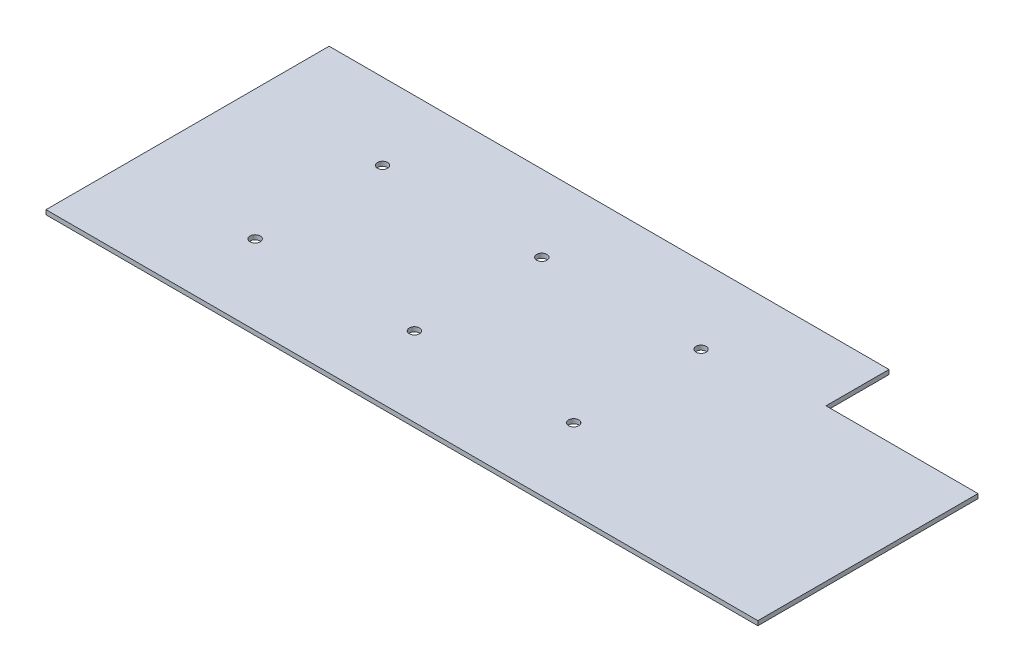
ISO-10303-21;
HEADER;
FILE_DESCRIPTION(('STEP AP214'),'2;1');
FILE_NAME('part.step','',(''),(''),'','','');
FILE_SCHEMA(('AUTOMOTIVE_DESIGN { 1 0 10303 214 1 1 1 1 }'));
ENDSEC;
DATA;
#1=APPLICATION_CONTEXT('core data for automotive mechanical design processes');
#2=APPLICATION_PROTOCOL_DEFINITION('international standard','automotive_design',2000,#1);
#3=PRODUCT_CONTEXT('',#1,'mechanical');
#4=PRODUCT('Part','Part','',(#3));
#5=PRODUCT_RELATED_PRODUCT_CATEGORY('part','',(#4));
#6=PRODUCT_DEFINITION_FORMATION('','',#4);
#7=PRODUCT_DEFINITION_CONTEXT('part definition',#1,'design');
#8=PRODUCT_DEFINITION('design','',#6,#7);
#9=PRODUCT_DEFINITION_SHAPE('','',#8);
#10=(LENGTH_UNIT() NAMED_UNIT(*) SI_UNIT(.MILLI.,.METRE.));
#11=(NAMED_UNIT(*) PLANE_ANGLE_UNIT() SI_UNIT($,.RADIAN.));
#12=(NAMED_UNIT(*) SI_UNIT($,.STERADIAN.) SOLID_ANGLE_UNIT());
#13=UNCERTAINTY_MEASURE_WITH_UNIT(LENGTH_MEASURE(1.E-05),#10,'distance_accuracy_value','');
#14=(GEOMETRIC_REPRESENTATION_CONTEXT(3) GLOBAL_UNCERTAINTY_ASSIGNED_CONTEXT((#13)) GLOBAL_UNIT_ASSIGNED_CONTEXT((#10,
#11,#12)) REPRESENTATION_CONTEXT('',''));
#15=CARTESIAN_POINT('',(0.,0.,0.));
#16=DIRECTION('',(0.,0.,1.));
#17=DIRECTION('',(1.,0.,0.));
#18=AXIS2_PLACEMENT_3D('',#15,#16,#17);
#19=CARTESIAN_POINT('',(558.8,3.5,0.));
#20=DIRECTION('',(0.,0.,-1.));
#21=DIRECTION('',(-1.,0.,0.));
#22=AXIS2_PLACEMENT_3D('',#19,#20,#21);
#23=PLANE('',#22);
#24=DIRECTION('',(1.,0.,0.));
#25=VECTOR('',#24,1.);
#26=CARTESIAN_POINT('',(558.8,0.,0.));
#27=LINE('',#26,#25);
#28=CARTESIAN_POINT('',(0.,0.,0.));
#29=VERTEX_POINT('',#28);
#30=CARTESIAN_POINT('',(558.8,0.,0.));
#31=VERTEX_POINT('',#30);
#32=EDGE_CURVE('E128',#29,#31,#27,.T.);
#33=ORIENTED_EDGE('',*,*,#32,.T.);
#34=DIRECTION('',(0.,-1.,0.));
#35=VECTOR('',#34,1.);
#36=CARTESIAN_POINT('',(558.8,3.5,0.));
#37=LINE('',#36,#35);
#38=CARTESIAN_POINT('',(558.8,3.5,0.));
#39=VERTEX_POINT('',#38);
#40=EDGE_CURVE('E11',#39,#31,#37,.T.);
#41=ORIENTED_EDGE('',*,*,#40,.F.);
#42=DIRECTION('',(1.,0.,0.));
#43=VECTOR('',#42,1.);
#44=CARTESIAN_POINT('',(558.8,3.5,0.));
#45=LINE('',#44,#43);
#46=CARTESIAN_POINT('',(0.,3.5,0.));
#47=VERTEX_POINT('',#46);
#48=EDGE_CURVE('E139',#47,#39,#45,.T.);
#49=ORIENTED_EDGE('',*,*,#48,.F.);
#50=DIRECTION('',(0.,-1.,0.));
#51=VECTOR('',#50,1.);
#52=CARTESIAN_POINT('',(0.,3.5,0.));
#53=LINE('',#52,#51);
#54=EDGE_CURVE('E124',#47,#29,#53,.T.);
#55=ORIENTED_EDGE('',*,*,#54,.T.);
#56=EDGE_LOOP('',(#33,#41,#49,#55));
#57=FACE_BOUND('',#56,.T.);
#58=ADVANCED_FACE('F44',(#57),#23,.F.);
#59=CARTESIAN_POINT('',(558.8,3.5,-172.8));
#60=DIRECTION('',(-1.,0.,0.));
#61=DIRECTION('',(0.,0.,1.));
#62=AXIS2_PLACEMENT_3D('',#59,#60,#61);
#63=PLANE('',#62);
#64=DIRECTION('',(0.,0.,-1.));
#65=VECTOR('',#64,1.);
#66=CARTESIAN_POINT('',(558.8,0.,-172.8));
#67=LINE('',#66,#65);
#68=CARTESIAN_POINT('',(558.8,0.,-172.8));
#69=VERTEX_POINT('',#68);
#70=EDGE_CURVE('E131',#31,#69,#67,.T.);
#71=ORIENTED_EDGE('',*,*,#70,.T.);
#72=DIRECTION('',(0.,-1.,0.));
#73=VECTOR('',#72,1.);
#74=CARTESIAN_POINT('',(558.8,3.5,-172.8));
#75=LINE('',#74,#73);
#76=CARTESIAN_POINT('',(558.8,3.5,-172.8));
#77=VERTEX_POINT('',#76);
#78=EDGE_CURVE('E52',#77,#69,#75,.T.);
#79=ORIENTED_EDGE('',*,*,#78,.F.);
#80=DIRECTION('',(0.,0.,-1.));
#81=VECTOR('',#80,1.);
#82=CARTESIAN_POINT('',(558.8,3.5,-172.8));
#83=LINE('',#82,#81);
#84=EDGE_CURVE('E97',#39,#77,#83,.T.);
#85=ORIENTED_EDGE('',*,*,#84,.F.);
#86=ORIENTED_EDGE('',*,*,#40,.T.);
#87=EDGE_LOOP('',(#71,#79,#85,#86));
#88=FACE_BOUND('',#87,.T.);
#89=ADVANCED_FACE('F165',(#88),#63,.F.);
#90=CARTESIAN_POINT('',(439.5,3.5,-172.8));
#91=DIRECTION('',(0.,0.,1.));
#92=DIRECTION('',(1.,0.,0.));
#93=AXIS2_PLACEMENT_3D('',#90,#91,#92);
#94=PLANE('',#93);
#95=DIRECTION('',(-1.,0.,0.));
#96=VECTOR('',#95,1.);
#97=CARTESIAN_POINT('',(439.5,0.,-172.8));
#98=LINE('',#97,#96);
#99=CARTESIAN_POINT('',(439.5,0.,-172.8));
#100=VERTEX_POINT('',#99);
#101=EDGE_CURVE('E134',#69,#100,#98,.T.);
#102=ORIENTED_EDGE('',*,*,#101,.T.);
#103=DIRECTION('',(0.,-1.,0.));
#104=VECTOR('',#103,1.);
#105=CARTESIAN_POINT('',(439.5,3.5,-172.8));
#106=LINE('',#105,#104);
#107=CARTESIAN_POINT('',(439.5,3.5,-172.8));
#108=VERTEX_POINT('',#107);
#109=EDGE_CURVE('E119',#108,#100,#106,.T.);
#110=ORIENTED_EDGE('',*,*,#109,.F.);
#111=DIRECTION('',(-1.,0.,0.));
#112=VECTOR('',#111,1.);
#113=CARTESIAN_POINT('',(439.5,3.5,-172.8));
#114=LINE('',#113,#112);
#115=EDGE_CURVE('E110',#77,#108,#114,.T.);
#116=ORIENTED_EDGE('',*,*,#115,.F.);
#117=ORIENTED_EDGE('',*,*,#78,.T.);
#118=EDGE_LOOP('',(#102,#110,#116,#117));
#119=FACE_BOUND('',#118,.T.);
#120=ADVANCED_FACE('F145',(#119),#94,.F.);
#121=CARTESIAN_POINT('',(439.5,3.5,-222.25));
#122=DIRECTION('',(-1.,0.,0.));
#123=DIRECTION('',(0.,0.,1.));
#124=AXIS2_PLACEMENT_3D('',#121,#122,#123);
#125=PLANE('',#124);
#126=DIRECTION('',(0.,0.,-1.));
#127=VECTOR('',#126,1.);
#128=CARTESIAN_POINT('',(439.5,0.,-222.25));
#129=LINE('',#128,#127);
#130=CARTESIAN_POINT('',(439.5,0.,-222.25));
#131=VERTEX_POINT('',#130);
#132=EDGE_CURVE('E118',#100,#131,#129,.T.);
#133=ORIENTED_EDGE('',*,*,#132,.T.);
#134=DIRECTION('',(0.,-1.,0.));
#135=VECTOR('',#134,1.);
#136=CARTESIAN_POINT('',(439.5,3.5,-222.25));
#137=LINE('',#136,#135);
#138=CARTESIAN_POINT('',(439.5,3.5,-222.25));
#139=VERTEX_POINT('',#138);
#140=EDGE_CURVE('E115',#139,#131,#137,.T.);
#141=ORIENTED_EDGE('',*,*,#140,.F.);
#142=DIRECTION('',(0.,0.,-1.));
#143=VECTOR('',#142,1.);
#144=CARTESIAN_POINT('',(439.5,3.5,-222.25));
#145=LINE('',#144,#143);
#146=EDGE_CURVE('E104',#108,#139,#145,.T.);
#147=ORIENTED_EDGE('',*,*,#146,.F.);
#148=ORIENTED_EDGE('',*,*,#109,.T.);
#149=EDGE_LOOP('',(#133,#141,#147,#148));
#150=FACE_BOUND('',#149,.T.);
#151=ADVANCED_FACE('F116',(#150),#125,.F.);
#152=CARTESIAN_POINT('',(0.,3.5,-222.25));
#153=DIRECTION('',(0.,0.,1.));
#154=DIRECTION('',(1.,0.,0.));
#155=AXIS2_PLACEMENT_3D('',#152,#153,#154);
#156=PLANE('',#155);
#157=DIRECTION('',(-1.,0.,0.));
#158=VECTOR('',#157,1.);
#159=CARTESIAN_POINT('',(0.,0.,-222.25));
#160=LINE('',#159,#158);
#161=CARTESIAN_POINT('',(0.,0.,-222.25));
#162=VERTEX_POINT('',#161);
#163=EDGE_CURVE('E83',#131,#162,#160,.T.);
#164=ORIENTED_EDGE('',*,*,#163,.T.);
#165=DIRECTION('',(0.,-1.,0.));
#166=VECTOR('',#165,1.);
#167=CARTESIAN_POINT('',(0.,3.5,-222.25));
#168=LINE('',#167,#166);
#169=CARTESIAN_POINT('',(0.,3.5,-222.25));
#170=VERTEX_POINT('',#169);
#171=EDGE_CURVE('E120',#170,#162,#168,.T.);
#172=ORIENTED_EDGE('',*,*,#171,.F.);
#173=DIRECTION('',(-1.,0.,0.));
#174=VECTOR('',#173,1.);
#175=CARTESIAN_POINT('',(0.,3.5,-222.25));
#176=LINE('',#175,#174);
#177=EDGE_CURVE('E108',#139,#170,#176,.T.);
#178=ORIENTED_EDGE('',*,*,#177,.F.);
#179=ORIENTED_EDGE('',*,*,#140,.T.);
#180=EDGE_LOOP('',(#164,#172,#178,#179));
#181=FACE_BOUND('',#180,.T.);
#182=ADVANCED_FACE('F122',(#181),#156,.F.);
#183=CARTESIAN_POINT('',(0.,3.5,0.));
#184=DIRECTION('',(1.,0.,0.));
#185=DIRECTION('',(0.,0.,-1.));
#186=AXIS2_PLACEMENT_3D('',#183,#184,#185);
#187=PLANE('',#186);
#188=DIRECTION('',(0.,0.,1.));
#189=VECTOR('',#188,1.);
#190=CARTESIAN_POINT('',(0.,0.,0.));
#191=LINE('',#190,#189);
#192=EDGE_CURVE('E89',#162,#29,#191,.T.);
#193=ORIENTED_EDGE('',*,*,#192,.T.);
#194=ORIENTED_EDGE('',*,*,#54,.F.);
#195=DIRECTION('',(0.,0.,1.));
#196=VECTOR('',#195,1.);
#197=CARTESIAN_POINT('',(0.,3.5,0.));
#198=LINE('',#197,#196);
#199=EDGE_CURVE('E60',#170,#47,#198,.T.);
#200=ORIENTED_EDGE('',*,*,#199,.F.);
#201=ORIENTED_EDGE('',*,*,#171,.T.);
#202=EDGE_LOOP('',(#193,#194,#200,#201));
#203=FACE_BOUND('',#202,.T.);
#204=ADVANCED_FACE('F152',(#203),#187,.F.);
#205=CARTESIAN_POINT('',(0.,3.5,0.));
#206=DIRECTION('',(0.,-1.,0.));
#207=DIRECTION('',(0.,0.,-1.));
#208=AXIS2_PLACEMENT_3D('',#205,#206,#207);
#209=PLANE('',#208);
#210=CARTESIAN_POINT('',(101.97168799,3.5,-62.2158083));
#211=DIRECTION('',(0.,-1.,0.));
#212=DIRECTION('',(0.,0.,-1.));
#213=AXIS2_PLACEMENT_3D('',#210,#211,#212);
#214=CIRCLE('',#213,4.00000000000001);
#215=CARTESIAN_POINT('',(101.97168799,3.5,-66.2158083));
#216=VERTEX_POINT('',#215);
#217=EDGE_CURVE('E132',#216,#216,#214,.T.);
#218=ORIENTED_EDGE('',*,*,#217,.T.);
#219=EDGE_LOOP('',(#218));
#220=FACE_BOUND('',#219,.T.);
#221=CARTESIAN_POINT('',(226.97168799,3.5,-62.2158083));
#222=DIRECTION('',(0.,-1.,0.));
#223=DIRECTION('',(0.,0.,-1.));
#224=AXIS2_PLACEMENT_3D('',#221,#222,#223);
#225=CIRCLE('',#224,3.99999999999999);
#226=CARTESIAN_POINT('',(226.97168799,3.5,-66.2158083));
#227=VERTEX_POINT('',#226);
#228=EDGE_CURVE('E338',#227,#227,#225,.T.);
#229=ORIENTED_EDGE('',*,*,#228,.T.);
#230=EDGE_LOOP('',(#229));
#231=FACE_BOUND('',#230,.T.);
#232=CARTESIAN_POINT('',(351.97168799,3.5,-62.2158083));
#233=DIRECTION('',(0.,-1.,0.));
#234=DIRECTION('',(0.,0.,-1.));
#235=AXIS2_PLACEMENT_3D('',#232,#233,#234);
#236=CIRCLE('',#235,3.99999999999999);
#237=CARTESIAN_POINT('',(351.97168799,3.5,-66.2158083));
#238=VERTEX_POINT('',#237);
#239=EDGE_CURVE('E341',#238,#238,#236,.T.);
#240=ORIENTED_EDGE('',*,*,#239,.T.);
#241=EDGE_LOOP('',(#240));
#242=FACE_BOUND('',#241,.T.);
#243=CARTESIAN_POINT('',(351.97168799,3.5,-162.2158083));
#244=DIRECTION('',(0.,-1.,0.));
#245=DIRECTION('',(0.,0.,-1.));
#246=AXIS2_PLACEMENT_3D('',#243,#244,#245);
#247=CIRCLE('',#246,3.99999999999999);
#248=CARTESIAN_POINT('',(351.97168799,3.5,-166.2158083));
#249=VERTEX_POINT('',#248);
#250=EDGE_CURVE('E348',#249,#249,#247,.T.);
#251=ORIENTED_EDGE('',*,*,#250,.T.);
#252=EDGE_LOOP('',(#251));
#253=FACE_BOUND('',#252,.T.);
#254=CARTESIAN_POINT('',(226.97168799,3.5,-162.2158083));
#255=DIRECTION('',(0.,-1.,0.));
#256=DIRECTION('',(0.,0.,-1.));
#257=AXIS2_PLACEMENT_3D('',#254,#255,#256);
#258=CIRCLE('',#257,3.99999999999999);
#259=CARTESIAN_POINT('',(226.97168799,3.5,-166.2158083));
#260=VERTEX_POINT('',#259);
#261=EDGE_CURVE('E351',#260,#260,#258,.T.);
#262=ORIENTED_EDGE('',*,*,#261,.T.);
#263=EDGE_LOOP('',(#262));
#264=FACE_BOUND('',#263,.T.);
#265=CARTESIAN_POINT('',(101.97168799,3.5,-162.2158083));
#266=DIRECTION('',(0.,-1.,0.));
#267=DIRECTION('',(0.,0.,-1.));
#268=AXIS2_PLACEMENT_3D('',#265,#266,#267);
#269=CIRCLE('',#268,4.00000000000001);
#270=CARTESIAN_POINT('',(101.97168799,3.5,-166.2158083));
#271=VERTEX_POINT('',#270);
#272=EDGE_CURVE('E354',#271,#271,#269,.T.);
#273=ORIENTED_EDGE('',*,*,#272,.T.);
#274=EDGE_LOOP('',(#273));
#275=FACE_BOUND('',#274,.T.);
#276=ORIENTED_EDGE('',*,*,#48,.T.);
#277=ORIENTED_EDGE('',*,*,#84,.T.);
#278=ORIENTED_EDGE('',*,*,#115,.T.);
#279=ORIENTED_EDGE('',*,*,#146,.T.);
#280=ORIENTED_EDGE('',*,*,#177,.T.);
#281=ORIENTED_EDGE('',*,*,#199,.T.);
#282=EDGE_LOOP('',(#276,#277,#278,#279,#280,#281));
#283=FACE_BOUND('',#282,.T.);
#284=ADVANCED_FACE('F106',(#220,#231,#242,#253,#264,#275,#283),#209,.F.);
#285=CARTESIAN_POINT('',(0.,0.,0.));
#286=DIRECTION('',(0.,-1.,0.));
#287=DIRECTION('',(0.,0.,-1.));
#288=AXIS2_PLACEMENT_3D('',#285,#286,#287);
#289=PLANE('',#288);
#290=CARTESIAN_POINT('',(101.97168799,0.,-62.2158083));
#291=DIRECTION('',(0.,1.,0.));
#292=DIRECTION('',(0.,0.,1.));
#293=AXIS2_PLACEMENT_3D('',#290,#291,#292);
#294=CIRCLE('',#293,4.00000000000001);
#295=CARTESIAN_POINT('',(101.97168799,0.,-58.2158083));
#296=VERTEX_POINT('',#295);
#297=EDGE_CURVE('E335',#296,#296,#294,.T.);
#298=ORIENTED_EDGE('',*,*,#297,.T.);
#299=EDGE_LOOP('',(#298));
#300=FACE_BOUND('',#299,.T.);
#301=CARTESIAN_POINT('',(226.97168799,0.,-62.2158083));
#302=DIRECTION('',(0.,1.,0.));
#303=DIRECTION('',(0.,0.,1.));
#304=AXIS2_PLACEMENT_3D('',#301,#302,#303);
#305=CIRCLE('',#304,3.99999999999999);
#306=CARTESIAN_POINT('',(226.97168799,0.,-58.2158083));
#307=VERTEX_POINT('',#306);
#308=EDGE_CURVE('E362',#307,#307,#305,.T.);
#309=ORIENTED_EDGE('',*,*,#308,.T.);
#310=EDGE_LOOP('',(#309));
#311=FACE_BOUND('',#310,.T.);
#312=CARTESIAN_POINT('',(351.97168799,0.,-62.2158083));
#313=DIRECTION('',(0.,1.,0.));
#314=DIRECTION('',(0.,0.,1.));
#315=AXIS2_PLACEMENT_3D('',#312,#313,#314);
#316=CIRCLE('',#315,3.99999999999999);
#317=CARTESIAN_POINT('',(351.97168799,0.,-58.2158083));
#318=VERTEX_POINT('',#317);
#319=EDGE_CURVE('E365',#318,#318,#316,.T.);
#320=ORIENTED_EDGE('',*,*,#319,.T.);
#321=EDGE_LOOP('',(#320));
#322=FACE_BOUND('',#321,.T.);
#323=CARTESIAN_POINT('',(351.97168799,0.,-162.2158083));
#324=DIRECTION('',(0.,1.,0.));
#325=DIRECTION('',(0.,0.,1.));
#326=AXIS2_PLACEMENT_3D('',#323,#324,#325);
#327=CIRCLE('',#326,3.99999999999999);
#328=CARTESIAN_POINT('',(351.97168799,0.,-158.2158083));
#329=VERTEX_POINT('',#328);
#330=EDGE_CURVE('E368',#329,#329,#327,.T.);
#331=ORIENTED_EDGE('',*,*,#330,.T.);
#332=EDGE_LOOP('',(#331));
#333=FACE_BOUND('',#332,.T.);
#334=CARTESIAN_POINT('',(226.97168799,0.,-162.2158083));
#335=DIRECTION('',(0.,1.,0.));
#336=DIRECTION('',(0.,0.,1.));
#337=AXIS2_PLACEMENT_3D('',#334,#335,#336);
#338=CIRCLE('',#337,3.99999999999999);
#339=CARTESIAN_POINT('',(226.97168799,0.,-158.2158083));
#340=VERTEX_POINT('',#339);
#341=EDGE_CURVE('E360',#340,#340,#338,.T.);
#342=ORIENTED_EDGE('',*,*,#341,.T.);
#343=EDGE_LOOP('',(#342));
#344=FACE_BOUND('',#343,.T.);
#345=CARTESIAN_POINT('',(101.97168799,0.,-162.2158083));
#346=DIRECTION('',(0.,1.,0.));
#347=DIRECTION('',(0.,0.,1.));
#348=AXIS2_PLACEMENT_3D('',#345,#346,#347);
#349=CIRCLE('',#348,4.00000000000001);
#350=CARTESIAN_POINT('',(101.97168799,0.,-158.2158083));
#351=VERTEX_POINT('',#350);
#352=EDGE_CURVE('E357',#351,#351,#349,.T.);
#353=ORIENTED_EDGE('',*,*,#352,.T.);
#354=EDGE_LOOP('',(#353));
#355=FACE_BOUND('',#354,.T.);
#356=ORIENTED_EDGE('',*,*,#32,.F.);
#357=ORIENTED_EDGE('',*,*,#192,.F.);
#358=ORIENTED_EDGE('',*,*,#163,.F.);
#359=ORIENTED_EDGE('',*,*,#132,.F.);
#360=ORIENTED_EDGE('',*,*,#101,.F.);
#361=ORIENTED_EDGE('',*,*,#70,.F.);
#362=EDGE_LOOP('',(#356,#357,#358,#359,#360,#361));
#363=FACE_BOUND('',#362,.T.);
#364=ADVANCED_FACE('F148',(#300,#311,#322,#333,#344,#355,#363),#289,.T.);
#365=CARTESIAN_POINT('',(101.97168799,0.,-162.2158083));
#366=DIRECTION('',(0.,1.,0.));
#367=DIRECTION('',(0.,0.,1.));
#368=AXIS2_PLACEMENT_3D('',#365,#366,#367);
#369=CYLINDRICAL_SURFACE('',#368,4.00000000000001);
#370=ORIENTED_EDGE('',*,*,#352,.F.);
#371=EDGE_LOOP('',(#370));
#372=FACE_BOUND('',#371,.T.);
#373=ORIENTED_EDGE('',*,*,#272,.F.);
#374=EDGE_LOOP('',(#373));
#375=FACE_BOUND('',#374,.T.);
#376=ADVANCED_FACE('F204',(#372,#375),#369,.F.);
#377=CARTESIAN_POINT('',(226.97168799,0.,-162.2158083));
#378=DIRECTION('',(0.,1.,0.));
#379=DIRECTION('',(0.,0.,1.));
#380=AXIS2_PLACEMENT_3D('',#377,#378,#379);
#381=CYLINDRICAL_SURFACE('',#380,3.99999999999999);
#382=ORIENTED_EDGE('',*,*,#341,.F.);
#383=EDGE_LOOP('',(#382));
#384=FACE_BOUND('',#383,.T.);
#385=ORIENTED_EDGE('',*,*,#261,.F.);
#386=EDGE_LOOP('',(#385));
#387=FACE_BOUND('',#386,.T.);
#388=ADVANCED_FACE('F215',(#384,#387),#381,.F.);
#389=CARTESIAN_POINT('',(351.97168799,0.,-162.2158083));
#390=DIRECTION('',(0.,1.,0.));
#391=DIRECTION('',(0.,0.,1.));
#392=AXIS2_PLACEMENT_3D('',#389,#390,#391);
#393=CYLINDRICAL_SURFACE('',#392,3.99999999999999);
#394=ORIENTED_EDGE('',*,*,#330,.F.);
#395=EDGE_LOOP('',(#394));
#396=FACE_BOUND('',#395,.T.);
#397=ORIENTED_EDGE('',*,*,#250,.F.);
#398=EDGE_LOOP('',(#397));
#399=FACE_BOUND('',#398,.T.);
#400=ADVANCED_FACE('F224',(#396,#399),#393,.F.);
#401=CARTESIAN_POINT('',(351.97168799,0.,-62.2158083));
#402=DIRECTION('',(0.,1.,0.));
#403=DIRECTION('',(0.,0.,1.));
#404=AXIS2_PLACEMENT_3D('',#401,#402,#403);
#405=CYLINDRICAL_SURFACE('',#404,3.99999999999999);
#406=ORIENTED_EDGE('',*,*,#319,.F.);
#407=EDGE_LOOP('',(#406));
#408=FACE_BOUND('',#407,.T.);
#409=ORIENTED_EDGE('',*,*,#239,.F.);
#410=EDGE_LOOP('',(#409));
#411=FACE_BOUND('',#410,.T.);
#412=ADVANCED_FACE('F234',(#408,#411),#405,.F.);
#413=CARTESIAN_POINT('',(226.97168799,0.,-62.2158083));
#414=DIRECTION('',(0.,1.,0.));
#415=DIRECTION('',(0.,0.,1.));
#416=AXIS2_PLACEMENT_3D('',#413,#414,#415);
#417=CYLINDRICAL_SURFACE('',#416,3.99999999999999);
#418=ORIENTED_EDGE('',*,*,#308,.F.);
#419=EDGE_LOOP('',(#418));
#420=FACE_BOUND('',#419,.T.);
#421=ORIENTED_EDGE('',*,*,#228,.F.);
#422=EDGE_LOOP('',(#421));
#423=FACE_BOUND('',#422,.T.);
#424=ADVANCED_FACE('F244',(#420,#423),#417,.F.);
#425=CARTESIAN_POINT('',(101.97168799,0.,-62.2158083));
#426=DIRECTION('',(0.,1.,0.));
#427=DIRECTION('',(0.,0.,1.));
#428=AXIS2_PLACEMENT_3D('',#425,#426,#427);
#429=CYLINDRICAL_SURFACE('',#428,4.00000000000001);
#430=ORIENTED_EDGE('',*,*,#297,.F.);
#431=EDGE_LOOP('',(#430));
#432=FACE_BOUND('',#431,.T.);
#433=ORIENTED_EDGE('',*,*,#217,.F.);
#434=EDGE_LOOP('',(#433));
#435=FACE_BOUND('',#434,.T.);
#436=ADVANCED_FACE('F254',(#432,#435),#429,.F.);
#437=CLOSED_SHELL('',(#58,#89,#120,#151,#182,#204,#284,#364,#376,#388,#400,#412,#424,#436));
#438=MANIFOLD_SOLID_BREP('B2',#437);
#439=ADVANCED_BREP_SHAPE_REPRESENTATION('',(#18,#438),#14);
#440=SHAPE_DEFINITION_REPRESENTATION(#9,#439);
ENDSEC;
END-ISO-10303-21;
